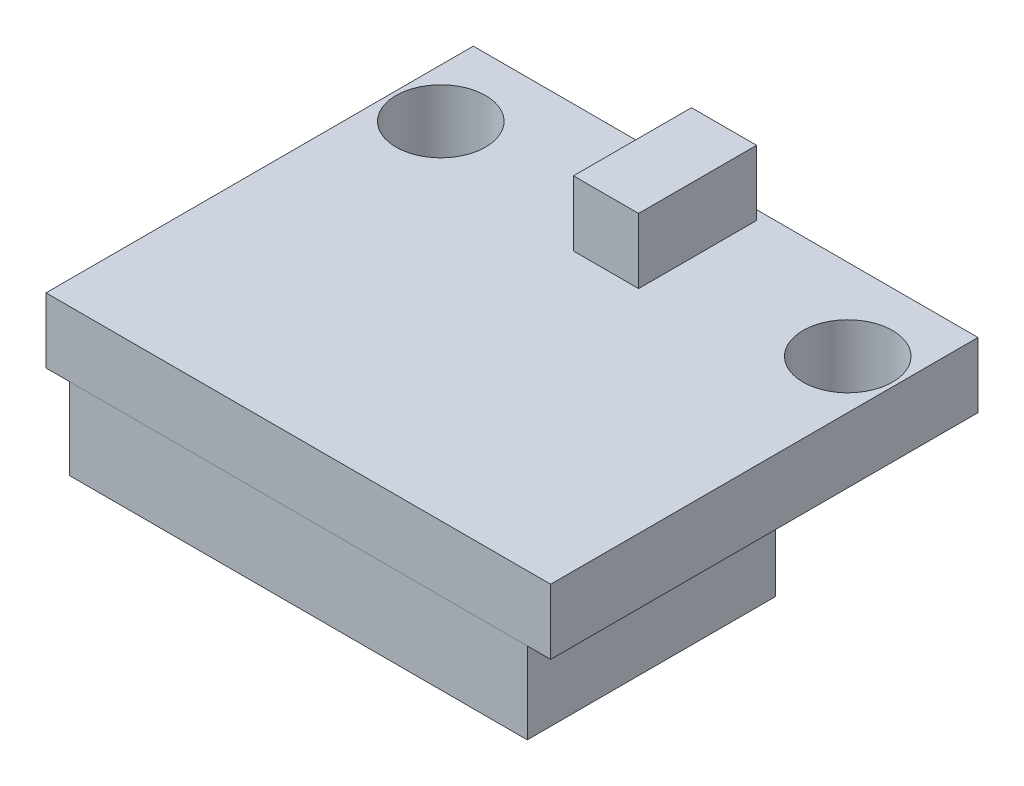
ISO-10303-21;
HEADER;
FILE_DESCRIPTION(('STEP AP214'),'2;1');
FILE_NAME('part.step','',(''),(''),'','','');
FILE_SCHEMA(('AUTOMOTIVE_DESIGN { 1 0 10303 214 1 1 1 1 }'));
ENDSEC;
DATA;
#1=APPLICATION_CONTEXT('core data for automotive mechanical design processes');
#2=APPLICATION_PROTOCOL_DEFINITION('international standard','automotive_design',2000,#1);
#3=PRODUCT_CONTEXT('',#1,'mechanical');
#4=PRODUCT('Part','Part','',(#3));
#5=PRODUCT_RELATED_PRODUCT_CATEGORY('part','',(#4));
#6=PRODUCT_DEFINITION_FORMATION('','',#4);
#7=PRODUCT_DEFINITION_CONTEXT('part definition',#1,'design');
#8=PRODUCT_DEFINITION('design','',#6,#7);
#9=PRODUCT_DEFINITION_SHAPE('','',#8);
#10=(LENGTH_UNIT() NAMED_UNIT(*) SI_UNIT(.MILLI.,.METRE.));
#11=(NAMED_UNIT(*) PLANE_ANGLE_UNIT() SI_UNIT($,.RADIAN.));
#12=(NAMED_UNIT(*) SI_UNIT($,.STERADIAN.) SOLID_ANGLE_UNIT());
#13=UNCERTAINTY_MEASURE_WITH_UNIT(LENGTH_MEASURE(1.E-05),#10,'distance_accuracy_value','');
#14=(GEOMETRIC_REPRESENTATION_CONTEXT(3) GLOBAL_UNCERTAINTY_ASSIGNED_CONTEXT((#13)) GLOBAL_UNIT_ASSIGNED_CONTEXT((#10,
#11,#12)) REPRESENTATION_CONTEXT('',''));
#15=CARTESIAN_POINT('',(0.,0.,0.));
#16=DIRECTION('',(0.,0.,1.));
#17=DIRECTION('',(1.,0.,0.));
#18=AXIS2_PLACEMENT_3D('',#15,#16,#17);
#19=CARTESIAN_POINT('',(-5.815,-2.,8.82));
#20=DIRECTION('',(1.,0.,0.));
#21=DIRECTION('',(0.,0.,-1.));
#22=AXIS2_PLACEMENT_3D('',#19,#20,#21);
#23=PLANE('',#22);
#24=DIRECTION('',(0.,0.,-1.));
#25=VECTOR('',#24,1.);
#26=CARTESIAN_POINT('',(-5.815,0.,8.82));
#27=LINE('',#26,#25);
#28=CARTESIAN_POINT('',(-5.815,0.,8.82));
#29=VERTEX_POINT('',#28);
#30=CARTESIAN_POINT('',(-5.815,0.,2.72));
#31=VERTEX_POINT('',#30);
#32=EDGE_CURVE('E110',#29,#31,#27,.T.);
#33=ORIENTED_EDGE('',*,*,#32,.T.);
#34=DIRECTION('',(0.,1.,0.));
#35=VECTOR('',#34,1.);
#36=CARTESIAN_POINT('',(-5.815,-2.,2.72));
#37=LINE('',#36,#35);
#38=CARTESIAN_POINT('',(-5.815,-2.,2.72));
#39=VERTEX_POINT('',#38);
#40=EDGE_CURVE('E12',#39,#31,#37,.T.);
#41=ORIENTED_EDGE('',*,*,#40,.F.);
#42=DIRECTION('',(0.,0.,-1.));
#43=VECTOR('',#42,1.);
#44=CARTESIAN_POINT('',(-5.815,-2.,8.82));
#45=LINE('',#44,#43);
#46=CARTESIAN_POINT('',(-5.815,-2.,8.82));
#47=VERTEX_POINT('',#46);
#48=EDGE_CURVE('E98',#47,#39,#45,.T.);
#49=ORIENTED_EDGE('',*,*,#48,.F.);
#50=DIRECTION('',(0.,1.,0.));
#51=VECTOR('',#50,1.);
#52=CARTESIAN_POINT('',(-5.815,-2.,8.82));
#53=LINE('',#52,#51);
#54=EDGE_CURVE('E106',#47,#29,#53,.T.);
#55=ORIENTED_EDGE('',*,*,#54,.T.);
#56=EDGE_LOOP('',(#33,#41,#49,#55));
#57=FACE_BOUND('',#56,.T.);
#58=ADVANCED_FACE('F47',(#57),#23,.F.);
#59=CARTESIAN_POINT('',(-5.815,-2.,2.72));
#60=DIRECTION('',(0.,0.,1.));
#61=DIRECTION('',(1.,0.,0.));
#62=AXIS2_PLACEMENT_3D('',#59,#60,#61);
#63=PLANE('',#62);
#64=DIRECTION('',(1.,0.,0.));
#65=VECTOR('',#64,1.);
#66=CARTESIAN_POINT('',(-5.815,0.,2.72));
#67=LINE('',#66,#65);
#68=CARTESIAN_POINT('',(5.435,0.,2.72));
#69=VERTEX_POINT('',#68);
#70=EDGE_CURVE('E102',#31,#69,#67,.T.);
#71=ORIENTED_EDGE('',*,*,#70,.T.);
#72=DIRECTION('',(0.,1.,0.));
#73=VECTOR('',#72,1.);
#74=CARTESIAN_POINT('',(5.435,-2.,2.72));
#75=LINE('',#74,#73);
#76=CARTESIAN_POINT('',(5.435,-2.,2.72));
#77=VERTEX_POINT('',#76);
#78=EDGE_CURVE('E55',#77,#69,#75,.T.);
#79=ORIENTED_EDGE('',*,*,#78,.F.);
#80=DIRECTION('',(1.,0.,0.));
#81=VECTOR('',#80,1.);
#82=CARTESIAN_POINT('',(-5.815,-2.,2.72));
#83=LINE('',#82,#81);
#84=EDGE_CURVE('E93',#39,#77,#83,.T.);
#85=ORIENTED_EDGE('',*,*,#84,.F.);
#86=ORIENTED_EDGE('',*,*,#40,.T.);
#87=EDGE_LOOP('',(#71,#79,#85,#86));
#88=FACE_BOUND('',#87,.T.);
#89=ADVANCED_FACE('F101',(#88),#63,.F.);
#90=CARTESIAN_POINT('',(5.435,-2.,8.82));
#91=DIRECTION('',(-1.,0.,0.));
#92=DIRECTION('',(0.,0.,1.));
#93=AXIS2_PLACEMENT_3D('',#90,#91,#92);
#94=PLANE('',#93);
#95=DIRECTION('',(0.,0.,1.));
#96=VECTOR('',#95,1.);
#97=CARTESIAN_POINT('',(5.435,0.,8.82));
#98=LINE('',#97,#96);
#99=CARTESIAN_POINT('',(5.435,0.,8.82));
#100=VERTEX_POINT('',#99);
#101=EDGE_CURVE('E80',#69,#100,#98,.T.);
#102=ORIENTED_EDGE('',*,*,#101,.T.);
#103=DIRECTION('',(0.,1.,0.));
#104=VECTOR('',#103,1.);
#105=CARTESIAN_POINT('',(5.435,-2.,8.82));
#106=LINE('',#105,#104);
#107=CARTESIAN_POINT('',(5.435,-2.,8.82));
#108=VERTEX_POINT('',#107);
#109=EDGE_CURVE('E103',#108,#100,#106,.T.);
#110=ORIENTED_EDGE('',*,*,#109,.F.);
#111=DIRECTION('',(0.,0.,1.));
#112=VECTOR('',#111,1.);
#113=CARTESIAN_POINT('',(5.435,-2.,8.82));
#114=LINE('',#113,#112);
#115=EDGE_CURVE('E96',#77,#108,#114,.T.);
#116=ORIENTED_EDGE('',*,*,#115,.F.);
#117=ORIENTED_EDGE('',*,*,#78,.T.);
#118=EDGE_LOOP('',(#102,#110,#116,#117));
#119=FACE_BOUND('',#118,.T.);
#120=ADVANCED_FACE('F104',(#119),#94,.F.);
#121=CARTESIAN_POINT('',(-5.815,-2.,8.82));
#122=DIRECTION('',(0.,0.,-1.));
#123=DIRECTION('',(-1.,0.,0.));
#124=AXIS2_PLACEMENT_3D('',#121,#122,#123);
#125=PLANE('',#124);
#126=DIRECTION('',(-1.,0.,0.));
#127=VECTOR('',#126,1.);
#128=CARTESIAN_POINT('',(-5.815,0.,8.82));
#129=LINE('',#128,#127);
#130=EDGE_CURVE('E86',#100,#29,#129,.T.);
#131=ORIENTED_EDGE('',*,*,#130,.T.);
#132=ORIENTED_EDGE('',*,*,#54,.F.);
#133=DIRECTION('',(-1.,0.,0.));
#134=VECTOR('',#133,1.);
#135=CARTESIAN_POINT('',(-5.815,-2.,8.82));
#136=LINE('',#135,#134);
#137=EDGE_CURVE('E63',#108,#47,#136,.T.);
#138=ORIENTED_EDGE('',*,*,#137,.F.);
#139=ORIENTED_EDGE('',*,*,#109,.T.);
#140=EDGE_LOOP('',(#131,#132,#138,#139));
#141=FACE_BOUND('',#140,.T.);
#142=ADVANCED_FACE('F117',(#141),#125,.F.);
#143=CARTESIAN_POINT('',(0.,-2.,0.));
#144=DIRECTION('',(0.,-1.,0.));
#145=DIRECTION('',(0.,0.,-1.));
#146=AXIS2_PLACEMENT_3D('',#143,#144,#145);
#147=PLANE('',#146);
#148=ORIENTED_EDGE('',*,*,#48,.T.);
#149=ORIENTED_EDGE('',*,*,#84,.T.);
#150=ORIENTED_EDGE('',*,*,#115,.T.);
#151=ORIENTED_EDGE('',*,*,#137,.T.);
#152=EDGE_LOOP('',(#148,#149,#150,#151));
#153=FACE_BOUND('',#152,.T.);
#154=ADVANCED_FACE('F94',(#153),#147,.T.);
#155=CARTESIAN_POINT('',(0.,0.,0.));
#156=DIRECTION('',(0.,-1.,0.));
#157=DIRECTION('',(0.,0.,-1.));
#158=AXIS2_PLACEMENT_3D('',#155,#156,#157);
#159=PLANE('',#158);
#160=ORIENTED_EDGE('',*,*,#32,.F.);
#161=ORIENTED_EDGE('',*,*,#130,.F.);
#162=ORIENTED_EDGE('',*,*,#101,.F.);
#163=ORIENTED_EDGE('',*,*,#70,.F.);
#164=EDGE_LOOP('',(#160,#161,#162,#163));
#165=FACE_BOUND('',#164,.T.);
#166=ADVANCED_FACE('F120',(#165),#159,.F.);
#167=CLOSED_SHELL('',(#58,#89,#120,#142,#154,#166));
#168=MANIFOLD_SOLID_BREP('B2',#167);
#169=CARTESIAN_POINT('',(0.8,3.2,1.45));
#170=DIRECTION('',(-1.,0.,0.));
#171=DIRECTION('',(0.,0.,1.));
#172=AXIS2_PLACEMENT_3D('',#169,#170,#171);
#173=PLANE('',#172);
#174=DIRECTION('',(0.,0.,-1.));
#175=VECTOR('',#174,1.);
#176=CARTESIAN_POINT('',(0.8,1.6,1.45));
#177=LINE('',#176,#175);
#178=CARTESIAN_POINT('',(0.8,1.6,1.45));
#179=VERTEX_POINT('',#178);
#180=CARTESIAN_POINT('',(0.8,1.6,-1.45));
#181=VERTEX_POINT('',#180);
#182=EDGE_CURVE('E242',#179,#181,#177,.T.);
#183=ORIENTED_EDGE('',*,*,#182,.T.);
#184=DIRECTION('',(0.,-1.,0.));
#185=VECTOR('',#184,1.);
#186=CARTESIAN_POINT('',(0.8,3.2,-1.45));
#187=LINE('',#186,#185);
#188=CARTESIAN_POINT('',(0.8,3.2,-1.45));
#189=VERTEX_POINT('',#188);
#190=EDGE_CURVE('E45',#189,#181,#187,.T.);
#191=ORIENTED_EDGE('',*,*,#190,.F.);
#192=DIRECTION('',(0.,0.,-1.));
#193=VECTOR('',#192,1.);
#194=CARTESIAN_POINT('',(0.8,3.2,1.45));
#195=LINE('',#194,#193);
#196=CARTESIAN_POINT('',(0.8,3.2,1.45));
#197=VERTEX_POINT('',#196);
#198=EDGE_CURVE('E230',#197,#189,#195,.T.);
#199=ORIENTED_EDGE('',*,*,#198,.F.);
#200=DIRECTION('',(0.,-1.,0.));
#201=VECTOR('',#200,1.);
#202=CARTESIAN_POINT('',(0.8,3.2,1.45));
#203=LINE('',#202,#201);
#204=EDGE_CURVE('E238',#197,#179,#203,.T.);
#205=ORIENTED_EDGE('',*,*,#204,.T.);
#206=EDGE_LOOP('',(#183,#191,#199,#205));
#207=FACE_BOUND('',#206,.T.);
#208=ADVANCED_FACE('F179',(#207),#173,.F.);
#209=CARTESIAN_POINT('',(-0.8,3.2,-1.45));
#210=DIRECTION('',(0.,0.,1.));
#211=DIRECTION('',(1.,0.,0.));
#212=AXIS2_PLACEMENT_3D('',#209,#210,#211);
#213=PLANE('',#212);
#214=DIRECTION('',(-1.,0.,0.));
#215=VECTOR('',#214,1.);
#216=CARTESIAN_POINT('',(-0.8,1.6,-1.45));
#217=LINE('',#216,#215);
#218=CARTESIAN_POINT('',(-0.8,1.6,-1.45));
#219=VERTEX_POINT('',#218);
#220=EDGE_CURVE('E234',#181,#219,#217,.T.);
#221=ORIENTED_EDGE('',*,*,#220,.T.);
#222=DIRECTION('',(0.,-1.,0.));
#223=VECTOR('',#222,1.);
#224=CARTESIAN_POINT('',(-0.8,3.2,-1.45));
#225=LINE('',#224,#223);
#226=CARTESIAN_POINT('',(-0.8,3.2,-1.45));
#227=VERTEX_POINT('',#226);
#228=EDGE_CURVE('E187',#227,#219,#225,.T.);
#229=ORIENTED_EDGE('',*,*,#228,.F.);
#230=DIRECTION('',(-1.,0.,0.));
#231=VECTOR('',#230,1.);
#232=CARTESIAN_POINT('',(-0.8,3.2,-1.45));
#233=LINE('',#232,#231);
#234=EDGE_CURVE('E225',#189,#227,#233,.T.);
#235=ORIENTED_EDGE('',*,*,#234,.F.);
#236=ORIENTED_EDGE('',*,*,#190,.T.);
#237=EDGE_LOOP('',(#221,#229,#235,#236));
#238=FACE_BOUND('',#237,.T.);
#239=ADVANCED_FACE('F233',(#238),#213,.F.);
#240=CARTESIAN_POINT('',(-0.8,3.2,1.45));
#241=DIRECTION('',(1.,0.,0.));
#242=DIRECTION('',(0.,0.,-1.));
#243=AXIS2_PLACEMENT_3D('',#240,#241,#242);
#244=PLANE('',#243);
#245=DIRECTION('',(0.,0.,1.));
#246=VECTOR('',#245,1.);
#247=CARTESIAN_POINT('',(-0.8,1.6,1.45));
#248=LINE('',#247,#246);
#249=CARTESIAN_POINT('',(-0.8,1.6,1.45));
#250=VERTEX_POINT('',#249);
#251=EDGE_CURVE('E212',#219,#250,#248,.T.);
#252=ORIENTED_EDGE('',*,*,#251,.T.);
#253=DIRECTION('',(0.,-1.,0.));
#254=VECTOR('',#253,1.);
#255=CARTESIAN_POINT('',(-0.8,3.2,1.45));
#256=LINE('',#255,#254);
#257=CARTESIAN_POINT('',(-0.8,3.2,1.45));
#258=VERTEX_POINT('',#257);
#259=EDGE_CURVE('E235',#258,#250,#256,.T.);
#260=ORIENTED_EDGE('',*,*,#259,.F.);
#261=DIRECTION('',(0.,0.,1.));
#262=VECTOR('',#261,1.);
#263=CARTESIAN_POINT('',(-0.8,3.2,1.45));
#264=LINE('',#263,#262);
#265=EDGE_CURVE('E228',#227,#258,#264,.T.);
#266=ORIENTED_EDGE('',*,*,#265,.F.);
#267=ORIENTED_EDGE('',*,*,#228,.T.);
#268=EDGE_LOOP('',(#252,#260,#266,#267));
#269=FACE_BOUND('',#268,.T.);
#270=ADVANCED_FACE('F236',(#269),#244,.F.);
#271=CARTESIAN_POINT('',(-0.8,3.2,1.45));
#272=DIRECTION('',(0.,0.,-1.));
#273=DIRECTION('',(-1.,0.,0.));
#274=AXIS2_PLACEMENT_3D('',#271,#272,#273);
#275=PLANE('',#274);
#276=DIRECTION('',(1.,0.,0.));
#277=VECTOR('',#276,1.);
#278=CARTESIAN_POINT('',(-0.8,1.6,1.45));
#279=LINE('',#278,#277);
#280=EDGE_CURVE('E218',#250,#179,#279,.T.);
#281=ORIENTED_EDGE('',*,*,#280,.T.);
#282=ORIENTED_EDGE('',*,*,#204,.F.);
#283=DIRECTION('',(1.,0.,0.));
#284=VECTOR('',#283,1.);
#285=CARTESIAN_POINT('',(-0.8,3.2,1.45));
#286=LINE('',#285,#284);
#287=EDGE_CURVE('E195',#258,#197,#286,.T.);
#288=ORIENTED_EDGE('',*,*,#287,.F.);
#289=ORIENTED_EDGE('',*,*,#259,.T.);
#290=EDGE_LOOP('',(#281,#282,#288,#289));
#291=FACE_BOUND('',#290,.T.);
#292=ADVANCED_FACE('F249',(#291),#275,.F.);
#293=CARTESIAN_POINT('',(0.,3.2,0.));
#294=DIRECTION('',(0.,-1.,0.));
#295=DIRECTION('',(0.,0.,-1.));
#296=AXIS2_PLACEMENT_3D('',#293,#294,#295);
#297=PLANE('',#296);
#298=ORIENTED_EDGE('',*,*,#198,.T.);
#299=ORIENTED_EDGE('',*,*,#234,.T.);
#300=ORIENTED_EDGE('',*,*,#265,.T.);
#301=ORIENTED_EDGE('',*,*,#287,.T.);
#302=EDGE_LOOP('',(#298,#299,#300,#301));
#303=FACE_BOUND('',#302,.T.);
#304=ADVANCED_FACE('F226',(#303),#297,.F.);
#305=CARTESIAN_POINT('',(0.,1.6,0.));
#306=DIRECTION('',(0.,-1.,0.));
#307=DIRECTION('',(0.,0.,-1.));
#308=AXIS2_PLACEMENT_3D('',#305,#306,#307);
#309=PLANE('',#308);
#310=ORIENTED_EDGE('',*,*,#182,.F.);
#311=ORIENTED_EDGE('',*,*,#280,.F.);
#312=ORIENTED_EDGE('',*,*,#251,.F.);
#313=ORIENTED_EDGE('',*,*,#220,.F.);
#314=EDGE_LOOP('',(#310,#311,#312,#313));
#315=FACE_BOUND('',#314,.T.);
#316=ADVANCED_FACE('F252',(#315),#309,.T.);
#317=CLOSED_SHELL('',(#208,#239,#270,#292,#304,#316));
#318=MANIFOLD_SOLID_BREP('B6',#317);
#319=CARTESIAN_POINT('',(-6.39,1.6,-1.68));
#320=DIRECTION('',(1.,0.,0.));
#321=DIRECTION('',(0.,0.,-1.));
#322=AXIS2_PLACEMENT_3D('',#319,#320,#321);
#323=PLANE('',#322);
#324=DIRECTION('',(0.,0.,1.));
#325=VECTOR('',#324,1.);
#326=CARTESIAN_POINT('',(-6.39,0.,-1.68));
#327=LINE('',#326,#325);
#328=CARTESIAN_POINT('',(-6.39,0.,-1.68));
#329=VERTEX_POINT('',#328);
#330=CARTESIAN_POINT('',(-6.39,0.,8.82));
#331=VERTEX_POINT('',#330);
#332=EDGE_CURVE('E365',#329,#331,#327,.T.);
#333=ORIENTED_EDGE('',*,*,#332,.T.);
#334=DIRECTION('',(0.,-1.,0.));
#335=VECTOR('',#334,1.);
#336=CARTESIAN_POINT('',(-6.39,1.6,8.82));
#337=LINE('',#336,#335);
#338=CARTESIAN_POINT('',(-6.39,1.6,8.82));
#339=VERTEX_POINT('',#338);
#340=EDGE_CURVE('E177',#339,#331,#337,.T.);
#341=ORIENTED_EDGE('',*,*,#340,.F.);
#342=DIRECTION('',(0.,0.,1.));
#343=VECTOR('',#342,1.);
#344=CARTESIAN_POINT('',(-6.39,1.6,-1.68));
#345=LINE('',#344,#343);
#346=CARTESIAN_POINT('',(-6.39,1.6,-1.68));
#347=VERTEX_POINT('',#346);
#348=EDGE_CURVE('E353',#347,#339,#345,.T.);
#349=ORIENTED_EDGE('',*,*,#348,.F.);
#350=DIRECTION('',(0.,-1.,0.));
#351=VECTOR('',#350,1.);
#352=CARTESIAN_POINT('',(-6.39,1.6,-1.68));
#353=LINE('',#352,#351);
#354=EDGE_CURVE('E361',#347,#329,#353,.T.);
#355=ORIENTED_EDGE('',*,*,#354,.T.);
#356=EDGE_LOOP('',(#333,#341,#349,#355));
#357=FACE_BOUND('',#356,.T.);
#358=ADVANCED_FACE('F302',(#357),#323,.F.);
#359=CARTESIAN_POINT('',(-6.39,1.6,8.82));
#360=DIRECTION('',(0.,0.,-1.));
#361=DIRECTION('',(-1.,0.,0.));
#362=AXIS2_PLACEMENT_3D('',#359,#360,#361);
#363=PLANE('',#362);
#364=DIRECTION('',(1.,0.,0.));
#365=VECTOR('',#364,1.);
#366=CARTESIAN_POINT('',(-6.39,0.,8.82));
#367=LINE('',#366,#365);
#368=CARTESIAN_POINT('',(6.01,0.,8.82));
#369=VERTEX_POINT('',#368);
#370=EDGE_CURVE('E357',#331,#369,#367,.T.);
#371=ORIENTED_EDGE('',*,*,#370,.T.);
#372=DIRECTION('',(0.,-1.,0.));
#373=VECTOR('',#372,1.);
#374=CARTESIAN_POINT('',(6.01,1.6,8.82));
#375=LINE('',#374,#373);
#376=CARTESIAN_POINT('',(6.01,1.6,8.82));
#377=VERTEX_POINT('',#376);
#378=EDGE_CURVE('E310',#377,#369,#375,.T.);
#379=ORIENTED_EDGE('',*,*,#378,.F.);
#380=DIRECTION('',(1.,0.,0.));
#381=VECTOR('',#380,1.);
#382=CARTESIAN_POINT('',(-6.39,1.6,8.82));
#383=LINE('',#382,#381);
#384=EDGE_CURVE('E348',#339,#377,#383,.T.);
#385=ORIENTED_EDGE('',*,*,#384,.F.);
#386=ORIENTED_EDGE('',*,*,#340,.T.);
#387=EDGE_LOOP('',(#371,#379,#385,#386));
#388=FACE_BOUND('',#387,.T.);
#389=ADVANCED_FACE('F356',(#388),#363,.F.);
#390=CARTESIAN_POINT('',(6.01,1.6,-1.68));
#391=DIRECTION('',(-1.,0.,0.));
#392=DIRECTION('',(0.,0.,1.));
#393=AXIS2_PLACEMENT_3D('',#390,#391,#392);
#394=PLANE('',#393);
#395=DIRECTION('',(0.,0.,-1.));
#396=VECTOR('',#395,1.);
#397=CARTESIAN_POINT('',(6.01,0.,-1.68));
#398=LINE('',#397,#396);
#399=CARTESIAN_POINT('',(6.01,0.,-1.68));
#400=VERTEX_POINT('',#399);
#401=EDGE_CURVE('E335',#369,#400,#398,.T.);
#402=ORIENTED_EDGE('',*,*,#401,.T.);
#403=DIRECTION('',(0.,-1.,0.));
#404=VECTOR('',#403,1.);
#405=CARTESIAN_POINT('',(6.01,1.6,-1.68));
#406=LINE('',#405,#404);
#407=CARTESIAN_POINT('',(6.01,1.6,-1.68));
#408=VERTEX_POINT('',#407);
#409=EDGE_CURVE('E358',#408,#400,#406,.T.);
#410=ORIENTED_EDGE('',*,*,#409,.F.);
#411=DIRECTION('',(0.,0.,-1.));
#412=VECTOR('',#411,1.);
#413=CARTESIAN_POINT('',(6.01,1.6,-1.68));
#414=LINE('',#413,#412);
#415=EDGE_CURVE('E351',#377,#408,#414,.T.);
#416=ORIENTED_EDGE('',*,*,#415,.F.);
#417=ORIENTED_EDGE('',*,*,#378,.T.);
#418=EDGE_LOOP('',(#402,#410,#416,#417));
#419=FACE_BOUND('',#418,.T.);
#420=ADVANCED_FACE('F359',(#419),#394,.F.);
#421=CARTESIAN_POINT('',(-6.39,1.6,-1.68));
#422=DIRECTION('',(0.,0.,1.));
#423=DIRECTION('',(1.,0.,0.));
#424=AXIS2_PLACEMENT_3D('',#421,#422,#423);
#425=PLANE('',#424);
#426=DIRECTION('',(-1.,0.,0.));
#427=VECTOR('',#426,1.);
#428=CARTESIAN_POINT('',(-6.39,0.,-1.68));
#429=LINE('',#428,#427);
#430=EDGE_CURVE('E341',#400,#329,#429,.T.);
#431=ORIENTED_EDGE('',*,*,#430,.T.);
#432=ORIENTED_EDGE('',*,*,#354,.F.);
#433=DIRECTION('',(-1.,0.,0.));
#434=VECTOR('',#433,1.);
#435=CARTESIAN_POINT('',(-6.39,1.6,-1.68));
#436=LINE('',#435,#434);
#437=EDGE_CURVE('E318',#408,#347,#436,.T.);
#438=ORIENTED_EDGE('',*,*,#437,.F.);
#439=ORIENTED_EDGE('',*,*,#409,.T.);
#440=EDGE_LOOP('',(#431,#432,#438,#439));
#441=FACE_BOUND('',#440,.T.);
#442=ADVANCED_FACE('F373',(#441),#425,.F.);
#443=CARTESIAN_POINT('',(0.,1.6,0.));
#444=DIRECTION('',(0.,1.,0.));
#445=DIRECTION('',(0.,0.,1.));
#446=AXIS2_PLACEMENT_3D('',#443,#444,#445);
#447=PLANE('',#446);
#448=CARTESIAN_POINT('',(4.81,1.6,0.319999999999997));
#449=DIRECTION('',(0.,1.,0.));
#450=DIRECTION('',(0.,0.,1.));
#451=AXIS2_PLACEMENT_3D('',#448,#449,#450);
#452=CIRCLE('',#451,1.1);
#453=CARTESIAN_POINT('',(4.81,1.6,1.42));
#454=VERTEX_POINT('',#453);
#455=EDGE_CURVE('E368',#454,#454,#452,.T.);
#456=ORIENTED_EDGE('',*,*,#455,.F.);
#457=EDGE_LOOP('',(#456));
#458=FACE_BOUND('',#457,.T.);
#459=CARTESIAN_POINT('',(-5.19,1.6,0.319999999999994));
#460=DIRECTION('',(0.,1.,0.));
#461=DIRECTION('',(0.,0.,-1.));
#462=AXIS2_PLACEMENT_3D('',#459,#460,#461);
#463=CIRCLE('',#462,1.1);
#464=CARTESIAN_POINT('',(-5.19,1.6,-0.780000000000006));
#465=VERTEX_POINT('',#464);
#466=EDGE_CURVE('E382',#465,#465,#463,.T.);
#467=ORIENTED_EDGE('',*,*,#466,.F.);
#468=EDGE_LOOP('',(#467));
#469=FACE_BOUND('',#468,.T.);
#470=ORIENTED_EDGE('',*,*,#348,.T.);
#471=ORIENTED_EDGE('',*,*,#384,.T.);
#472=ORIENTED_EDGE('',*,*,#415,.T.);
#473=ORIENTED_EDGE('',*,*,#437,.T.);
#474=EDGE_LOOP('',(#470,#471,#472,#473));
#475=FACE_BOUND('',#474,.T.);
#476=ADVANCED_FACE('F349',(#458,#469,#475),#447,.T.);
#477=CARTESIAN_POINT('',(0.,0.,0.));
#478=DIRECTION('',(0.,1.,0.));
#479=DIRECTION('',(0.,0.,1.));
#480=AXIS2_PLACEMENT_3D('',#477,#478,#479);
#481=PLANE('',#480);
#482=CARTESIAN_POINT('',(4.81,0.,0.319999999999997));
#483=DIRECTION('',(0.,1.,0.));
#484=DIRECTION('',(0.,0.,1.));
#485=AXIS2_PLACEMENT_3D('',#482,#483,#484);
#486=CIRCLE('',#485,1.1);
#487=CARTESIAN_POINT('',(4.81,0.,1.42));
#488=VERTEX_POINT('',#487);
#489=EDGE_CURVE('E385',#488,#488,#486,.T.);
#490=ORIENTED_EDGE('',*,*,#489,.T.);
#491=EDGE_LOOP('',(#490));
#492=FACE_BOUND('',#491,.T.);
#493=CARTESIAN_POINT('',(-5.19,0.,0.319999999999994));
#494=DIRECTION('',(0.,1.,0.));
#495=DIRECTION('',(0.,0.,-1.));
#496=AXIS2_PLACEMENT_3D('',#493,#494,#495);
#497=CIRCLE('',#496,1.1);
#498=CARTESIAN_POINT('',(-5.19,0.,-0.780000000000006));
#499=VERTEX_POINT('',#498);
#500=EDGE_CURVE('E379',#499,#499,#497,.T.);
#501=ORIENTED_EDGE('',*,*,#500,.T.);
#502=EDGE_LOOP('',(#501));
#503=FACE_BOUND('',#502,.T.);
#504=ORIENTED_EDGE('',*,*,#332,.F.);
#505=ORIENTED_EDGE('',*,*,#430,.F.);
#506=ORIENTED_EDGE('',*,*,#401,.F.);
#507=ORIENTED_EDGE('',*,*,#370,.F.);
#508=EDGE_LOOP('',(#504,#505,#506,#507));
#509=FACE_BOUND('',#508,.T.);
#510=ADVANCED_FACE('F376',(#492,#503,#509),#481,.F.);
#511=CARTESIAN_POINT('',(-5.19,1.6,0.319999999999994));
#512=DIRECTION('',(0.,-1.,0.));
#513=DIRECTION('',(0.,0.,-1.));
#514=AXIS2_PLACEMENT_3D('',#511,#512,#513);
#515=CYLINDRICAL_SURFACE('',#514,1.1);
#516=ORIENTED_EDGE('',*,*,#466,.T.);
#517=EDGE_LOOP('',(#516));
#518=FACE_BOUND('',#517,.T.);
#519=ORIENTED_EDGE('',*,*,#500,.F.);
#520=EDGE_LOOP('',(#519));
#521=FACE_BOUND('',#520,.T.);
#522=ADVANCED_FACE('F399',(#518,#521),#515,.F.);
#523=CARTESIAN_POINT('',(4.81,1.6,0.319999999999997));
#524=DIRECTION('',(0.,-1.,0.));
#525=DIRECTION('',(0.,0.,-1.));
#526=AXIS2_PLACEMENT_3D('',#523,#524,#525);
#527=CYLINDRICAL_SURFACE('',#526,1.1);
#528=ORIENTED_EDGE('',*,*,#455,.T.);
#529=EDGE_LOOP('',(#528));
#530=FACE_BOUND('',#529,.T.);
#531=ORIENTED_EDGE('',*,*,#489,.F.);
#532=EDGE_LOOP('',(#531));
#533=FACE_BOUND('',#532,.T.);
#534=ADVANCED_FACE('F391',(#530,#533),#527,.F.);
#535=CLOSED_SHELL('',(#358,#389,#420,#442,#476,#510,#522,#534));
#536=MANIFOLD_SOLID_BREP('B39',#535);
#537=ADVANCED_BREP_SHAPE_REPRESENTATION('',(#18,#168,#318,#536),#14);
#538=SHAPE_DEFINITION_REPRESENTATION(#9,#537);
ENDSEC;
END-ISO-10303-21;
